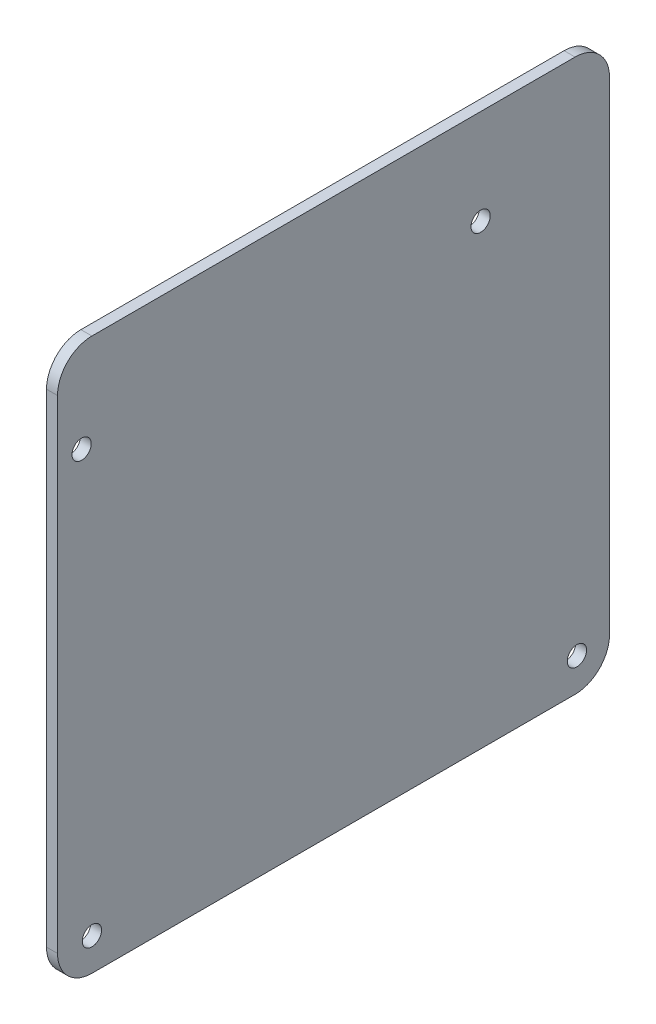
ISO-10303-21;
HEADER;
FILE_DESCRIPTION(('STEP AP214'),'2;1');
FILE_NAME('part.step','',(''),(''),'','','');
FILE_SCHEMA(('AUTOMOTIVE_DESIGN { 1 0 10303 214 1 1 1 1 }'));
ENDSEC;
DATA;
#1=APPLICATION_CONTEXT('core data for automotive mechanical design processes');
#2=APPLICATION_PROTOCOL_DEFINITION('international standard','automotive_design',2000,#1);
#3=PRODUCT_CONTEXT('',#1,'mechanical');
#4=PRODUCT('Part','Part','',(#3));
#5=PRODUCT_RELATED_PRODUCT_CATEGORY('part','',(#4));
#6=PRODUCT_DEFINITION_FORMATION('','',#4);
#7=PRODUCT_DEFINITION_CONTEXT('part definition',#1,'design');
#8=PRODUCT_DEFINITION('design','',#6,#7);
#9=PRODUCT_DEFINITION_SHAPE('','',#8);
#10=(LENGTH_UNIT() NAMED_UNIT(*) SI_UNIT(.MILLI.,.METRE.));
#11=(NAMED_UNIT(*) PLANE_ANGLE_UNIT() SI_UNIT($,.RADIAN.));
#12=(NAMED_UNIT(*) SI_UNIT($,.STERADIAN.) SOLID_ANGLE_UNIT());
#13=UNCERTAINTY_MEASURE_WITH_UNIT(LENGTH_MEASURE(1.E-05),#10,'distance_accuracy_value','');
#14=(GEOMETRIC_REPRESENTATION_CONTEXT(3) GLOBAL_UNCERTAINTY_ASSIGNED_CONTEXT((#13)) GLOBAL_UNIT_ASSIGNED_CONTEXT((#10,
#11,#12)) REPRESENTATION_CONTEXT('',''));
#15=CARTESIAN_POINT('',(0.,0.,0.));
#16=DIRECTION('',(0.,0.,1.));
#17=DIRECTION('',(1.,0.,0.));
#18=AXIS2_PLACEMENT_3D('',#15,#16,#17);
#19=CARTESIAN_POINT('',(0.8,-35.115,35.115));
#20=DIRECTION('',(1.,0.,0.));
#21=DIRECTION('',(0.,0.,-1.));
#22=AXIS2_PLACEMENT_3D('',#19,#20,#21);
#23=PLANE('',#22);
#24=CARTESIAN_POINT('',(0.8,26.315,-21.3842241327416));
#25=DIRECTION('',(1.,0.,0.));
#26=DIRECTION('',(0.,0.,-1.));
#27=AXIS2_PLACEMENT_3D('',#24,#25,#26);
#28=CIRCLE('',#27,1.4);
#29=CARTESIAN_POINT('',(0.8,26.315,-22.7842241327416));
#30=VERTEX_POINT('',#29);
#31=EDGE_CURVE('E196',#30,#30,#28,.T.);
#32=ORIENTED_EDGE('',*,*,#31,.F.);
#33=EDGE_LOOP('',(#32));
#34=FACE_BOUND('',#33,.T.);
#35=CARTESIAN_POINT('',(0.8,26.615,36.615));
#36=DIRECTION('',(1.,0.,0.));
#37=DIRECTION('',(0.,0.,-1.));
#38=AXIS2_PLACEMENT_3D('',#35,#36,#37);
#39=CIRCLE('',#38,1.4);
#40=CARTESIAN_POINT('',(0.8,26.615,35.215));
#41=VERTEX_POINT('',#40);
#42=EDGE_CURVE('E142',#41,#41,#39,.T.);
#43=ORIENTED_EDGE('',*,*,#42,.F.);
#44=EDGE_LOOP('',(#43));
#45=FACE_BOUND('',#44,.T.);
#46=CARTESIAN_POINT('',(0.8,-35.115,35.115));
#47=DIRECTION('',(1.,0.,0.));
#48=DIRECTION('',(0.,0.,-1.));
#49=AXIS2_PLACEMENT_3D('',#46,#47,#48);
#50=CIRCLE('',#49,5.);
#51=CARTESIAN_POINT('',(0.8,-35.115,40.115));
#52=VERTEX_POINT('',#51);
#53=CARTESIAN_POINT('',(0.8,-40.115,35.115));
#54=VERTEX_POINT('',#53);
#55=EDGE_CURVE('E153',#52,#54,#50,.T.);
#56=ORIENTED_EDGE('',*,*,#55,.T.);
#57=DIRECTION('',(0.,0.,-1.));
#58=VECTOR('',#57,1.);
#59=CARTESIAN_POINT('',(0.8,-40.115,35.115));
#60=LINE('',#59,#58);
#61=CARTESIAN_POINT('',(0.8,-40.115,-35.115));
#62=VERTEX_POINT('',#61);
#63=EDGE_CURVE('E101',#54,#62,#60,.T.);
#64=ORIENTED_EDGE('',*,*,#63,.T.);
#65=CARTESIAN_POINT('',(0.8,-35.115,-35.115));
#66=DIRECTION('',(1.,0.,0.));
#67=DIRECTION('',(0.,0.,-1.));
#68=AXIS2_PLACEMENT_3D('',#65,#66,#67);
#69=CIRCLE('',#68,5.);
#70=CARTESIAN_POINT('',(0.8,-35.115,-40.115));
#71=VERTEX_POINT('',#70);
#72=EDGE_CURVE('E168',#62,#71,#69,.T.);
#73=ORIENTED_EDGE('',*,*,#72,.T.);
#74=DIRECTION('',(0.,1.,0.));
#75=VECTOR('',#74,1.);
#76=CARTESIAN_POINT('',(0.8,-35.115,-40.115));
#77=LINE('',#76,#75);
#78=CARTESIAN_POINT('',(0.8,35.115,-40.115));
#79=VERTEX_POINT('',#78);
#80=EDGE_CURVE('E181',#71,#79,#77,.T.);
#81=ORIENTED_EDGE('',*,*,#80,.T.);
#82=CARTESIAN_POINT('',(0.8,35.115,-35.115));
#83=DIRECTION('',(1.,0.,0.));
#84=DIRECTION('',(0.,0.,-1.));
#85=AXIS2_PLACEMENT_3D('',#82,#83,#84);
#86=CIRCLE('',#85,5.);
#87=CARTESIAN_POINT('',(0.8,40.115,-35.115));
#88=VERTEX_POINT('',#87);
#89=EDGE_CURVE('E120',#79,#88,#86,.T.);
#90=ORIENTED_EDGE('',*,*,#89,.T.);
#91=DIRECTION('',(0.,0.,1.));
#92=VECTOR('',#91,1.);
#93=CARTESIAN_POINT('',(0.8,40.115,35.115));
#94=LINE('',#93,#92);
#95=CARTESIAN_POINT('',(0.8,40.115,35.115));
#96=VERTEX_POINT('',#95);
#97=EDGE_CURVE('E114',#88,#96,#94,.T.);
#98=ORIENTED_EDGE('',*,*,#97,.T.);
#99=CARTESIAN_POINT('',(0.8,35.115,35.115));
#100=DIRECTION('',(1.,0.,0.));
#101=DIRECTION('',(0.,0.,-1.));
#102=AXIS2_PLACEMENT_3D('',#99,#100,#101);
#103=CIRCLE('',#102,5.);
#104=CARTESIAN_POINT('',(0.8,35.115,40.115));
#105=VERTEX_POINT('',#104);
#106=EDGE_CURVE('E118',#96,#105,#103,.T.);
#107=ORIENTED_EDGE('',*,*,#106,.T.);
#108=DIRECTION('',(0.,-1.,0.));
#109=VECTOR('',#108,1.);
#110=CARTESIAN_POINT('',(0.8,-35.115,40.115));
#111=LINE('',#110,#109);
#112=EDGE_CURVE('E58',#105,#52,#111,.T.);
#113=ORIENTED_EDGE('',*,*,#112,.T.);
#114=EDGE_LOOP('',(#56,#64,#73,#81,#90,#98,#107,#113));
#115=FACE_BOUND('',#114,.T.);
#116=CARTESIAN_POINT('',(0.8,-35.385,-35.3842241327417));
#117=DIRECTION('',(1.,0.,0.));
#118=DIRECTION('',(0.,0.,-1.));
#119=AXIS2_PLACEMENT_3D('',#116,#117,#118);
#120=CIRCLE('',#119,1.4);
#121=CARTESIAN_POINT('',(0.8,-35.385,-36.7842241327417));
#122=VERTEX_POINT('',#121);
#123=EDGE_CURVE('E190',#122,#122,#120,.T.);
#124=ORIENTED_EDGE('',*,*,#123,.F.);
#125=EDGE_LOOP('',(#124));
#126=FACE_BOUND('',#125,.T.);
#127=CARTESIAN_POINT('',(0.8,-35.385,35.115));
#128=DIRECTION('',(1.,0.,0.));
#129=DIRECTION('',(0.,0.,-1.));
#130=AXIS2_PLACEMENT_3D('',#127,#128,#129);
#131=CIRCLE('',#130,1.4);
#132=CARTESIAN_POINT('',(0.8,-35.385,33.715));
#133=VERTEX_POINT('',#132);
#134=EDGE_CURVE('E202',#133,#133,#131,.T.);
#135=ORIENTED_EDGE('',*,*,#134,.F.);
#136=EDGE_LOOP('',(#135));
#137=FACE_BOUND('',#136,.T.);
#138=ADVANCED_FACE('F41',(#34,#45,#115,#126,#137),#23,.T.);
#139=CARTESIAN_POINT('',(-0.8,-35.115,35.115));
#140=DIRECTION('',(1.,0.,0.));
#141=DIRECTION('',(0.,0.,-1.));
#142=AXIS2_PLACEMENT_3D('',#139,#140,#141);
#143=PLANE('',#142);
#144=CARTESIAN_POINT('',(-0.8,-35.115,35.115));
#145=DIRECTION('',(1.,0.,0.));
#146=DIRECTION('',(0.,0.,-1.));
#147=AXIS2_PLACEMENT_3D('',#144,#145,#146);
#148=CIRCLE('',#147,5.);
#149=CARTESIAN_POINT('',(-0.8,-35.115,40.115));
#150=VERTEX_POINT('',#149);
#151=CARTESIAN_POINT('',(-0.8,-40.115,35.115));
#152=VERTEX_POINT('',#151);
#153=EDGE_CURVE('E138',#150,#152,#148,.T.);
#154=ORIENTED_EDGE('',*,*,#153,.F.);
#155=DIRECTION('',(0.,-1.,0.));
#156=VECTOR('',#155,1.);
#157=CARTESIAN_POINT('',(-0.8,-35.115,40.115));
#158=LINE('',#157,#156);
#159=CARTESIAN_POINT('',(-0.8,35.115,40.115));
#160=VERTEX_POINT('',#159);
#161=EDGE_CURVE('E93',#160,#150,#158,.T.);
#162=ORIENTED_EDGE('',*,*,#161,.F.);
#163=CARTESIAN_POINT('',(-0.8,35.115,35.115));
#164=DIRECTION('',(1.,0.,0.));
#165=DIRECTION('',(0.,0.,-1.));
#166=AXIS2_PLACEMENT_3D('',#163,#164,#165);
#167=CIRCLE('',#166,5.);
#168=CARTESIAN_POINT('',(-0.8,40.115,35.115));
#169=VERTEX_POINT('',#168);
#170=EDGE_CURVE('E87',#169,#160,#167,.T.);
#171=ORIENTED_EDGE('',*,*,#170,.F.);
#172=DIRECTION('',(0.,0.,1.));
#173=VECTOR('',#172,1.);
#174=CARTESIAN_POINT('',(-0.8,40.115,35.115));
#175=LINE('',#174,#173);
#176=CARTESIAN_POINT('',(-0.8,40.115,-35.115));
#177=VERTEX_POINT('',#176);
#178=EDGE_CURVE('E128',#177,#169,#175,.T.);
#179=ORIENTED_EDGE('',*,*,#178,.F.);
#180=CARTESIAN_POINT('',(-0.8,35.115,-35.115));
#181=DIRECTION('',(1.,0.,0.));
#182=DIRECTION('',(0.,0.,-1.));
#183=AXIS2_PLACEMENT_3D('',#180,#181,#182);
#184=CIRCLE('',#183,5.);
#185=CARTESIAN_POINT('',(-0.8,35.115,-40.115));
#186=VERTEX_POINT('',#185);
#187=EDGE_CURVE('E148',#186,#177,#184,.T.);
#188=ORIENTED_EDGE('',*,*,#187,.F.);
#189=DIRECTION('',(0.,1.,0.));
#190=VECTOR('',#189,1.);
#191=CARTESIAN_POINT('',(-0.8,-35.115,-40.115));
#192=LINE('',#191,#190);
#193=CARTESIAN_POINT('',(-0.8,-35.115,-40.115));
#194=VERTEX_POINT('',#193);
#195=EDGE_CURVE('E146',#194,#186,#192,.T.);
#196=ORIENTED_EDGE('',*,*,#195,.F.);
#197=CARTESIAN_POINT('',(-0.8,-35.115,-35.115));
#198=DIRECTION('',(1.,0.,0.));
#199=DIRECTION('',(0.,0.,-1.));
#200=AXIS2_PLACEMENT_3D('',#197,#198,#199);
#201=CIRCLE('',#200,5.);
#202=CARTESIAN_POINT('',(-0.8,-40.115,-35.115));
#203=VERTEX_POINT('',#202);
#204=EDGE_CURVE('E144',#203,#194,#201,.T.);
#205=ORIENTED_EDGE('',*,*,#204,.F.);
#206=DIRECTION('',(0.,0.,-1.));
#207=VECTOR('',#206,1.);
#208=CARTESIAN_POINT('',(-0.8,-40.115,35.115));
#209=LINE('',#208,#207);
#210=EDGE_CURVE('E141',#152,#203,#209,.T.);
#211=ORIENTED_EDGE('',*,*,#210,.F.);
#212=EDGE_LOOP('',(#154,#162,#171,#179,#188,#196,#205,#211));
#213=FACE_BOUND('',#212,.T.);
#214=CARTESIAN_POINT('',(-0.8,26.615,36.615));
#215=DIRECTION('',(1.,0.,0.));
#216=DIRECTION('',(0.,0.,-1.));
#217=AXIS2_PLACEMENT_3D('',#214,#215,#216);
#218=CIRCLE('',#217,1.4);
#219=CARTESIAN_POINT('',(-0.8,26.615,35.215));
#220=VERTEX_POINT('',#219);
#221=EDGE_CURVE('E187',#220,#220,#218,.T.);
#222=ORIENTED_EDGE('',*,*,#221,.T.);
#223=EDGE_LOOP('',(#222));
#224=FACE_BOUND('',#223,.T.);
#225=CARTESIAN_POINT('',(-0.8,-35.385,-35.3842241327417));
#226=DIRECTION('',(1.,0.,0.));
#227=DIRECTION('',(0.,0.,-1.));
#228=AXIS2_PLACEMENT_3D('',#225,#226,#227);
#229=CIRCLE('',#228,1.4);
#230=CARTESIAN_POINT('',(-0.8,-35.385,-36.7842241327417));
#231=VERTEX_POINT('',#230);
#232=EDGE_CURVE('E193',#231,#231,#229,.T.);
#233=ORIENTED_EDGE('',*,*,#232,.T.);
#234=EDGE_LOOP('',(#233));
#235=FACE_BOUND('',#234,.T.);
#236=CARTESIAN_POINT('',(-0.8,26.315,-21.3842241327416));
#237=DIRECTION('',(1.,0.,0.));
#238=DIRECTION('',(0.,0.,-1.));
#239=AXIS2_PLACEMENT_3D('',#236,#237,#238);
#240=CIRCLE('',#239,1.4);
#241=CARTESIAN_POINT('',(-0.8,26.315,-22.7842241327416));
#242=VERTEX_POINT('',#241);
#243=EDGE_CURVE('E199',#242,#242,#240,.T.);
#244=ORIENTED_EDGE('',*,*,#243,.T.);
#245=EDGE_LOOP('',(#244));
#246=FACE_BOUND('',#245,.T.);
#247=CARTESIAN_POINT('',(-0.8,-35.385,35.115));
#248=DIRECTION('',(1.,0.,0.));
#249=DIRECTION('',(0.,0.,-1.));
#250=AXIS2_PLACEMENT_3D('',#247,#248,#249);
#251=CIRCLE('',#250,1.4);
#252=CARTESIAN_POINT('',(-0.8,-35.385,33.715));
#253=VERTEX_POINT('',#252);
#254=EDGE_CURVE('E205',#253,#253,#251,.T.);
#255=ORIENTED_EDGE('',*,*,#254,.T.);
#256=EDGE_LOOP('',(#255));
#257=FACE_BOUND('',#256,.T.);
#258=ADVANCED_FACE('F172',(#213,#224,#235,#246,#257),#143,.F.);
#259=CARTESIAN_POINT('',(0.8,-35.115,35.115));
#260=DIRECTION('',(-1.,0.,0.));
#261=DIRECTION('',(0.,0.,1.));
#262=AXIS2_PLACEMENT_3D('',#259,#260,#261);
#263=CYLINDRICAL_SURFACE('',#262,5.);
#264=ORIENTED_EDGE('',*,*,#153,.T.);
#265=DIRECTION('',(-1.,0.,0.));
#266=VECTOR('',#265,1.);
#267=CARTESIAN_POINT('',(0.8,-40.115,35.115));
#268=LINE('',#267,#266);
#269=EDGE_CURVE('E11',#54,#152,#268,.T.);
#270=ORIENTED_EDGE('',*,*,#269,.F.);
#271=ORIENTED_EDGE('',*,*,#55,.F.);
#272=DIRECTION('',(-1.,0.,0.));
#273=VECTOR('',#272,1.);
#274=CARTESIAN_POINT('',(0.8,-35.115,40.115));
#275=LINE('',#274,#273);
#276=EDGE_CURVE('E134',#52,#150,#275,.T.);
#277=ORIENTED_EDGE('',*,*,#276,.T.);
#278=EDGE_LOOP('',(#264,#270,#271,#277));
#279=FACE_BOUND('',#278,.T.);
#280=ADVANCED_FACE('F43',(#279),#263,.T.);
#281=CARTESIAN_POINT('',(0.8,-40.115,35.115));
#282=DIRECTION('',(0.,1.,0.));
#283=DIRECTION('',(0.,0.,1.));
#284=AXIS2_PLACEMENT_3D('',#281,#282,#283);
#285=PLANE('',#284);
#286=ORIENTED_EDGE('',*,*,#210,.T.);
#287=DIRECTION('',(-1.,0.,0.));
#288=VECTOR('',#287,1.);
#289=CARTESIAN_POINT('',(0.8,-40.115,-35.115));
#290=LINE('',#289,#288);
#291=EDGE_CURVE('E50',#62,#203,#290,.T.);
#292=ORIENTED_EDGE('',*,*,#291,.F.);
#293=ORIENTED_EDGE('',*,*,#63,.F.);
#294=ORIENTED_EDGE('',*,*,#269,.T.);
#295=EDGE_LOOP('',(#286,#292,#293,#294));
#296=FACE_BOUND('',#295,.T.);
#297=ADVANCED_FACE('F239',(#296),#285,.F.);
#298=CARTESIAN_POINT('',(0.8,-35.115,-35.115));
#299=DIRECTION('',(-1.,0.,0.));
#300=DIRECTION('',(0.,0.,1.));
#301=AXIS2_PLACEMENT_3D('',#298,#299,#300);
#302=CYLINDRICAL_SURFACE('',#301,5.);
#303=ORIENTED_EDGE('',*,*,#204,.T.);
#304=DIRECTION('',(-1.,0.,0.));
#305=VECTOR('',#304,1.);
#306=CARTESIAN_POINT('',(0.8,-35.115,-40.115));
#307=LINE('',#306,#305);
#308=EDGE_CURVE('E160',#71,#194,#307,.T.);
#309=ORIENTED_EDGE('',*,*,#308,.F.);
#310=ORIENTED_EDGE('',*,*,#72,.F.);
#311=ORIENTED_EDGE('',*,*,#291,.T.);
#312=EDGE_LOOP('',(#303,#309,#310,#311));
#313=FACE_BOUND('',#312,.T.);
#314=ADVANCED_FACE('F166',(#313),#302,.T.);
#315=CARTESIAN_POINT('',(0.8,-35.115,-40.115));
#316=DIRECTION('',(0.,0.,1.));
#317=DIRECTION('',(1.,0.,0.));
#318=AXIS2_PLACEMENT_3D('',#315,#316,#317);
#319=PLANE('',#318);
#320=ORIENTED_EDGE('',*,*,#195,.T.);
#321=DIRECTION('',(-1.,0.,0.));
#322=VECTOR('',#321,1.);
#323=CARTESIAN_POINT('',(0.8,35.115,-40.115));
#324=LINE('',#323,#322);
#325=EDGE_CURVE('E157',#79,#186,#324,.T.);
#326=ORIENTED_EDGE('',*,*,#325,.F.);
#327=ORIENTED_EDGE('',*,*,#80,.F.);
#328=ORIENTED_EDGE('',*,*,#308,.T.);
#329=EDGE_LOOP('',(#320,#326,#327,#328));
#330=FACE_BOUND('',#329,.T.);
#331=ADVANCED_FACE('F177',(#330),#319,.F.);
#332=CARTESIAN_POINT('',(0.8,35.115,-35.115));
#333=DIRECTION('',(-1.,0.,0.));
#334=DIRECTION('',(0.,0.,1.));
#335=AXIS2_PLACEMENT_3D('',#332,#333,#334);
#336=CYLINDRICAL_SURFACE('',#335,5.);
#337=ORIENTED_EDGE('',*,*,#187,.T.);
#338=DIRECTION('',(-1.,0.,0.));
#339=VECTOR('',#338,1.);
#340=CARTESIAN_POINT('',(0.8,40.115,-35.115));
#341=LINE('',#340,#339);
#342=EDGE_CURVE('E129',#88,#177,#341,.T.);
#343=ORIENTED_EDGE('',*,*,#342,.F.);
#344=ORIENTED_EDGE('',*,*,#89,.F.);
#345=ORIENTED_EDGE('',*,*,#325,.T.);
#346=EDGE_LOOP('',(#337,#343,#344,#345));
#347=FACE_BOUND('',#346,.T.);
#348=ADVANCED_FACE('F180',(#347),#336,.T.);
#349=CARTESIAN_POINT('',(0.8,40.115,35.115));
#350=DIRECTION('',(0.,-1.,0.));
#351=DIRECTION('',(0.,0.,-1.));
#352=AXIS2_PLACEMENT_3D('',#349,#350,#351);
#353=PLANE('',#352);
#354=ORIENTED_EDGE('',*,*,#178,.T.);
#355=DIRECTION('',(-1.,0.,0.));
#356=VECTOR('',#355,1.);
#357=CARTESIAN_POINT('',(0.8,40.115,35.115));
#358=LINE('',#357,#356);
#359=EDGE_CURVE('E125',#96,#169,#358,.T.);
#360=ORIENTED_EDGE('',*,*,#359,.F.);
#361=ORIENTED_EDGE('',*,*,#97,.F.);
#362=ORIENTED_EDGE('',*,*,#342,.T.);
#363=EDGE_LOOP('',(#354,#360,#361,#362));
#364=FACE_BOUND('',#363,.T.);
#365=ADVANCED_FACE('F126',(#364),#353,.F.);
#366=CARTESIAN_POINT('',(0.8,35.115,35.115));
#367=DIRECTION('',(-1.,0.,0.));
#368=DIRECTION('',(0.,0.,1.));
#369=AXIS2_PLACEMENT_3D('',#366,#367,#368);
#370=CYLINDRICAL_SURFACE('',#369,5.);
#371=ORIENTED_EDGE('',*,*,#170,.T.);
#372=DIRECTION('',(-1.,0.,0.));
#373=VECTOR('',#372,1.);
#374=CARTESIAN_POINT('',(0.8,35.115,40.115));
#375=LINE('',#374,#373);
#376=EDGE_CURVE('E130',#105,#160,#375,.T.);
#377=ORIENTED_EDGE('',*,*,#376,.F.);
#378=ORIENTED_EDGE('',*,*,#106,.F.);
#379=ORIENTED_EDGE('',*,*,#359,.T.);
#380=EDGE_LOOP('',(#371,#377,#378,#379));
#381=FACE_BOUND('',#380,.T.);
#382=ADVANCED_FACE('F132',(#381),#370,.T.);
#383=CARTESIAN_POINT('',(0.8,-35.115,40.115));
#384=DIRECTION('',(0.,0.,-1.));
#385=DIRECTION('',(-1.,0.,0.));
#386=AXIS2_PLACEMENT_3D('',#383,#384,#385);
#387=PLANE('',#386);
#388=ORIENTED_EDGE('',*,*,#161,.T.);
#389=ORIENTED_EDGE('',*,*,#276,.F.);
#390=ORIENTED_EDGE('',*,*,#112,.F.);
#391=ORIENTED_EDGE('',*,*,#376,.T.);
#392=EDGE_LOOP('',(#388,#389,#390,#391));
#393=FACE_BOUND('',#392,.T.);
#394=ADVANCED_FACE('F227',(#393),#387,.F.);
#395=CARTESIAN_POINT('',(0.8,26.615,36.615));
#396=DIRECTION('',(-1.,0.,0.));
#397=DIRECTION('',(0.,0.,1.));
#398=AXIS2_PLACEMENT_3D('',#395,#396,#397);
#399=CYLINDRICAL_SURFACE('',#398,1.4);
#400=ORIENTED_EDGE('',*,*,#42,.T.);
#401=EDGE_LOOP('',(#400));
#402=FACE_BOUND('',#401,.T.);
#403=ORIENTED_EDGE('',*,*,#221,.F.);
#404=EDGE_LOOP('',(#403));
#405=FACE_BOUND('',#404,.T.);
#406=ADVANCED_FACE('F224',(#402,#405),#399,.F.);
#407=CARTESIAN_POINT('',(0.8,-35.385,-35.3842241327417));
#408=DIRECTION('',(-1.,0.,0.));
#409=DIRECTION('',(0.,0.,1.));
#410=AXIS2_PLACEMENT_3D('',#407,#408,#409);
#411=CYLINDRICAL_SURFACE('',#410,1.4);
#412=ORIENTED_EDGE('',*,*,#123,.T.);
#413=EDGE_LOOP('',(#412));
#414=FACE_BOUND('',#413,.T.);
#415=ORIENTED_EDGE('',*,*,#232,.F.);
#416=EDGE_LOOP('',(#415));
#417=FACE_BOUND('',#416,.T.);
#418=ADVANCED_FACE('F315',(#414,#417),#411,.F.);
#419=CARTESIAN_POINT('',(0.8,26.315,-21.3842241327416));
#420=DIRECTION('',(-1.,0.,0.));
#421=DIRECTION('',(0.,0.,1.));
#422=AXIS2_PLACEMENT_3D('',#419,#420,#421);
#423=CYLINDRICAL_SURFACE('',#422,1.4);
#424=ORIENTED_EDGE('',*,*,#31,.T.);
#425=EDGE_LOOP('',(#424));
#426=FACE_BOUND('',#425,.T.);
#427=ORIENTED_EDGE('',*,*,#243,.F.);
#428=EDGE_LOOP('',(#427));
#429=FACE_BOUND('',#428,.T.);
#430=ADVANCED_FACE('F324',(#426,#429),#423,.F.);
#431=CARTESIAN_POINT('',(0.8,-35.385,35.115));
#432=DIRECTION('',(-1.,0.,0.));
#433=DIRECTION('',(0.,0.,1.));
#434=AXIS2_PLACEMENT_3D('',#431,#432,#433);
#435=CYLINDRICAL_SURFACE('',#434,1.4);
#436=ORIENTED_EDGE('',*,*,#134,.T.);
#437=EDGE_LOOP('',(#436));
#438=FACE_BOUND('',#437,.T.);
#439=ORIENTED_EDGE('',*,*,#254,.F.);
#440=EDGE_LOOP('',(#439));
#441=FACE_BOUND('',#440,.T.);
#442=ADVANCED_FACE('F211',(#438,#441),#435,.F.);
#443=CLOSED_SHELL('',(#138,#258,#280,#297,#314,#331,#348,#365,#382,#394,#406,#418,#430,#442));
#444=MANIFOLD_SOLID_BREP('B2',#443);
#445=ADVANCED_BREP_SHAPE_REPRESENTATION('',(#18,#444),#14);
#446=SHAPE_DEFINITION_REPRESENTATION(#9,#445);
ENDSEC;
END-ISO-10303-21;
